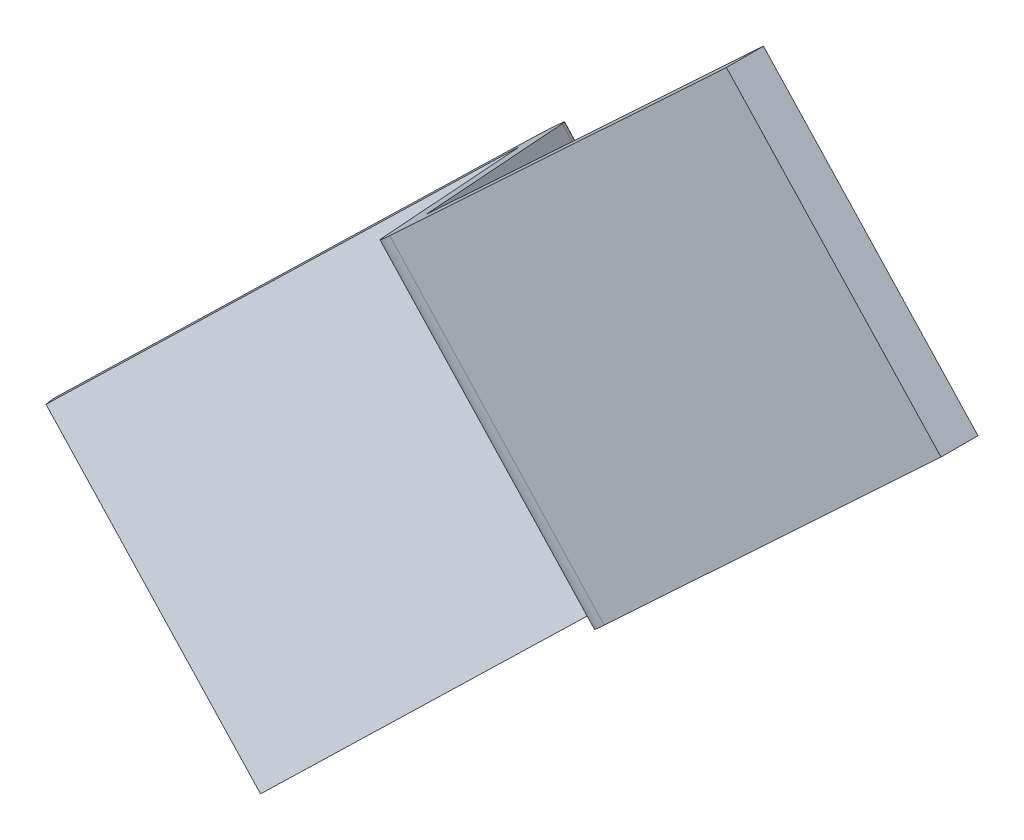
ISO-10303-21;
HEADER;
FILE_DESCRIPTION(('STEP AP214'),'2;1');
FILE_NAME('part.step','',(''),(''),'','','');
FILE_SCHEMA(('AUTOMOTIVE_DESIGN { 1 0 10303 214 1 1 1 1 }'));
ENDSEC;
DATA;
#1=APPLICATION_CONTEXT('core data for automotive mechanical design processes');
#2=APPLICATION_PROTOCOL_DEFINITION('international standard','automotive_design',2000,#1);
#3=PRODUCT_CONTEXT('',#1,'mechanical');
#4=PRODUCT('Part','Part','',(#3));
#5=PRODUCT_RELATED_PRODUCT_CATEGORY('part','',(#4));
#6=PRODUCT_DEFINITION_FORMATION('','',#4);
#7=PRODUCT_DEFINITION_CONTEXT('part definition',#1,'design');
#8=PRODUCT_DEFINITION('design','',#6,#7);
#9=PRODUCT_DEFINITION_SHAPE('','',#8);
#10=(LENGTH_UNIT() NAMED_UNIT(*) SI_UNIT(.MILLI.,.METRE.));
#11=(NAMED_UNIT(*) PLANE_ANGLE_UNIT() SI_UNIT($,.RADIAN.));
#12=(NAMED_UNIT(*) SI_UNIT($,.STERADIAN.) SOLID_ANGLE_UNIT());
#13=UNCERTAINTY_MEASURE_WITH_UNIT(LENGTH_MEASURE(1.E-05),#10,'distance_accuracy_value','');
#14=(GEOMETRIC_REPRESENTATION_CONTEXT(3) GLOBAL_UNCERTAINTY_ASSIGNED_CONTEXT((#13)) GLOBAL_UNIT_ASSIGNED_CONTEXT((#10,
#11,#12)) REPRESENTATION_CONTEXT('',''));
#15=CARTESIAN_POINT('',(0.,0.,0.));
#16=DIRECTION('',(0.,0.,1.));
#17=DIRECTION('',(1.,0.,0.));
#18=AXIS2_PLACEMENT_3D('',#15,#16,#17);
#19=CARTESIAN_POINT('',(22.9122875965679,20.3534318370849,-7.62204851457724));
#20=DIRECTION('',(0.517187243764899,0.482200533893165,0.707106781186557));
#21=DIRECTION('',(0.807143437979565,0.,-0.59035537646957));
#22=AXIS2_PLACEMENT_3D('',#19,#20,#21);
#23=PLANE('',#22);
#24=DIRECTION('',(0.517187243764915,0.482200533893179,-0.707106781186536));
#25=VECTOR('',#24,1.);
#26=CARTESIAN_POINT('',(21.5375233187465,19.0716676854461,-5.74244851457725));
#27=LINE('',#26,#25);
#28=CARTESIAN_POINT('',(21.5375233187465,19.0716676854461,-5.74244851457725));
#29=VERTEX_POINT('',#28);
#30=CARTESIAN_POINT('',(22.8969066656849,20.3390913962233,-7.60101945661142));
#31=VERTEX_POINT('',#30);
#32=EDGE_CURVE('E86',#29,#31,#27,.T.);
#33=ORIENTED_EDGE('',*,*,#32,.F.);
#34=DIRECTION('',(0.681934534815275,-0.731413214418686,0.));
#35=VECTOR('',#34,1.);
#36=CARTESIAN_POINT('',(21.5375233187465,19.0716676854461,-5.74244851457725));
#37=LINE('',#36,#35);
#38=CARTESIAN_POINT('',(23.0098199794127,17.4925465555161,-5.74244851457724));
#39=VERTEX_POINT('',#38);
#40=EDGE_CURVE('E181',#29,#39,#37,.T.);
#41=ORIENTED_EDGE('',*,*,#40,.T.);
#42=DIRECTION('',(-0.517187243764908,-0.482200533893174,0.707106781186544));
#43=VECTOR('',#42,1.);
#44=CARTESIAN_POINT('',(24.3692033263511,18.7599702662934,-7.60101945661137));
#45=LINE('',#44,#43);
#46=CARTESIAN_POINT('',(24.369203326351,18.7599702662933,-7.60101945661137));
#47=VERTEX_POINT('',#46);
#48=EDGE_CURVE('E187',#47,#39,#45,.T.);
#49=ORIENTED_EDGE('',*,*,#48,.F.);
#50=DIRECTION('',(0.681934534815202,-0.731413214418754,0.));
#51=VECTOR('',#50,1.);
#52=CARTESIAN_POINT('',(22.8969066656849,20.3390913962234,-7.60101945661147));
#53=LINE('',#52,#51);
#54=EDGE_CURVE('E244',#47,#31,#53,.F.);
#55=ORIENTED_EDGE('',*,*,#54,.T.);
#56=EDGE_LOOP('',(#33,#41,#49,#55));
#57=FACE_BOUND('',#56,.T.);
#58=ADVANCED_FACE('F17',(#57),#23,.T.);
#59=CARTESIAN_POINT('',(21.4061577588302,18.9491887498372,-5.92205363699863));
#60=DIRECTION('',(0.51718724376491,0.482200533893174,-0.707106781186543));
#61=DIRECTION('',(-0.807143437979553,0.,-0.590355376469586));
#62=AXIS2_PLACEMENT_3D('',#59,#60,#61);
#63=PLANE('',#62);
#64=ORIENTED_EDGE('',*,*,#40,.F.);
#65=DIRECTION('',(0.517187243764958,0.482200533893111,0.707106781186551));
#66=VECTOR('',#65,1.);
#67=CARTESIAN_POINT('',(21.4061577588302,18.9491887498372,-5.92205363699863));
#68=LINE('',#67,#66);
#69=CARTESIAN_POINT('',(21.4061577588302,18.9491887498372,-5.92205363699864));
#70=VERTEX_POINT('',#69);
#71=EDGE_CURVE('E183',#70,#29,#68,.T.);
#72=ORIENTED_EDGE('',*,*,#71,.F.);
#73=DIRECTION('',(0.681934534815275,-0.731413214418686,0.));
#74=VECTOR('',#73,1.);
#75=CARTESIAN_POINT('',(21.4061577588302,18.9491887498372,-5.92205363699864));
#76=LINE('',#75,#74);
#77=CARTESIAN_POINT('',(22.8784544194964,17.3700676199072,-5.92205363699865));
#78=VERTEX_POINT('',#77);
#79=EDGE_CURVE('E234',#70,#78,#76,.T.);
#80=ORIENTED_EDGE('',*,*,#79,.T.);
#81=DIRECTION('',(-0.517187243764894,-0.482200533893157,-0.707106781186566));
#82=VECTOR('',#81,1.);
#83=CARTESIAN_POINT('',(23.0098199794127,17.4925465555161,-5.74244851457724));
#84=LINE('',#83,#82);
#85=EDGE_CURVE('E185',#39,#78,#84,.T.);
#86=ORIENTED_EDGE('',*,*,#85,.F.);
#87=EDGE_LOOP('',(#64,#72,#80,#86));
#88=FACE_BOUND('',#87,.T.);
#89=ADVANCED_FACE('F173',(#88),#63,.F.);
#90=CARTESIAN_POINT('',(22.9100432216765,20.3513392897842,-7.58305894436923));
#91=DIRECTION('',(0.681934534815202,-0.731413214418754,0.));
#92=DIRECTION('',(0.731413214418754,0.681934534815202,0.));
#93=AXIS2_PLACEMENT_3D('',#90,#91,#92);
#94=CYLINDRICAL_SURFACE('',#93,0.0254000000000002);
#95=DIRECTION('',(0.681934534815273,-0.731413214418687,0.));
#96=VECTOR('',#95,1.);
#97=CARTESIAN_POINT('',(22.9250730549741,20.3653523841282,-7.59798868977747));
#98=LINE('',#97,#96);
#99=CARTESIAN_POINT('',(22.925073054974,20.3653523841282,-7.59798868977746));
#100=VERTEX_POINT('',#99);
#101=CARTESIAN_POINT('',(24.3973697156402,18.7862312541982,-7.59798868977746));
#102=VERTEX_POINT('',#101);
#103=EDGE_CURVE('E226',#100,#102,#98,.T.);
#104=ORIENTED_EDGE('',*,*,#103,.F.);
#105=CARTESIAN_POINT('',(22.9100432216765,20.3513392897842,-7.58305894436923));
#106=DIRECTION('',(0.681934534815202,-0.731413214418754,0.));
#107=DIRECTION('',(0.731413214418754,0.681934534815202,0.));
#108=AXIS2_PLACEMENT_3D('',#105,#106,#107);
#109=CIRCLE('',#108,0.0254000000000002);
#110=EDGE_CURVE('E20',#31,#100,#109,.T.);
#111=ORIENTED_EDGE('',*,*,#110,.F.);
#112=ORIENTED_EDGE('',*,*,#54,.F.);
#113=CARTESIAN_POINT('',(24.3823398823425,18.7722181598541,-7.58305894436923));
#114=DIRECTION('',(0.681934534815202,-0.731413214418754,0.));
#115=DIRECTION('',(0.731413214418754,0.681934534815202,0.));
#116=AXIS2_PLACEMENT_3D('',#113,#114,#115);
#117=CIRCLE('',#116,0.0254000000000002);
#118=EDGE_CURVE('E225',#102,#47,#117,.F.);
#119=ORIENTED_EDGE('',*,*,#118,.F.);
#120=EDGE_LOOP('',(#104,#111,#112,#119));
#121=FACE_BOUND('',#120,.T.);
#122=ADVANCED_FACE('F170',(#121),#94,.F.);
#123=CARTESIAN_POINT('',(22.7809220366516,20.230952901476,-7.80165363699862));
#124=DIRECTION('',(0.517187243764899,0.482200533893165,0.707106781186557));
#125=DIRECTION('',(0.807143437979565,0.,-0.59035537646957));
#126=AXIS2_PLACEMENT_3D('',#123,#124,#125);
#127=PLANE('',#126);
#128=ORIENTED_EDGE('',*,*,#79,.F.);
#129=DIRECTION('',(-0.517187243764916,-0.482200533893175,0.707106781186538));
#130=VECTOR('',#129,1.);
#131=CARTESIAN_POINT('',(22.7655411057686,20.2166124606144,-7.78062457903277));
#132=LINE('',#131,#130);
#133=CARTESIAN_POINT('',(22.7655411057686,20.2166124606145,-7.78062457903277));
#134=VERTEX_POINT('',#133);
#135=EDGE_CURVE('E191',#134,#70,#132,.T.);
#136=ORIENTED_EDGE('',*,*,#135,.F.);
#137=DIRECTION('',(0.681934534815266,-0.731413214418694,0.));
#138=VECTOR('',#137,1.);
#139=CARTESIAN_POINT('',(22.7655411057686,20.2166124606145,-7.78062457903278));
#140=LINE('',#139,#138);
#141=CARTESIAN_POINT('',(24.2378377664348,18.6374913306845,-7.78062457903276));
#142=VERTEX_POINT('',#141);
#143=EDGE_CURVE('E222',#142,#134,#140,.F.);
#144=ORIENTED_EDGE('',*,*,#143,.F.);
#145=DIRECTION('',(0.517187243764915,0.482200533893175,-0.707106781186538));
#146=VECTOR('',#145,1.);
#147=CARTESIAN_POINT('',(22.8784544194964,17.3700676199072,-5.92205363699865));
#148=LINE('',#147,#146);
#149=EDGE_CURVE('E231',#78,#142,#148,.T.);
#150=ORIENTED_EDGE('',*,*,#149,.F.);
#151=EDGE_LOOP('',(#128,#136,#144,#150));
#152=FACE_BOUND('',#151,.T.);
#153=ADVANCED_FACE('F166',(#152),#127,.F.);
#154=CARTESIAN_POINT('',(24.0460886230661,21.4105334321013,-5.48844851457723));
#155=DIRECTION('',(-0.591725720375126,-0.551696627716727,0.587785252292476));
#156=DIRECTION('',(0.704740571445321,0.,0.709465099183126));
#157=AXIS2_PLACEMENT_3D('',#154,#155,#156);
#158=PLANE('',#157);
#159=DIRECTION('',(0.429913900767142,0.400831062593347,0.809016994374944));
#160=VECTOR('',#159,1.);
#161=CARTESIAN_POINT('',(22.925073054974,20.3653523841282,-7.59798868977746));
#162=LINE('',#161,#160);
#163=CARTESIAN_POINT('',(23.9848854737211,21.3534705566228,-5.6036213150867));
#164=VERTEX_POINT('',#163);
#165=EDGE_CURVE('E224',#100,#164,#162,.T.);
#166=ORIENTED_EDGE('',*,*,#165,.F.);
#167=ORIENTED_EDGE('',*,*,#103,.T.);
#168=DIRECTION('',(-0.429913900767142,-0.400831062593347,-0.809016994374944));
#169=VECTOR('',#168,1.);
#170=CARTESIAN_POINT('',(25.4571821343874,19.7743494266928,-5.60362131508671));
#171=LINE('',#170,#169);
#172=CARTESIAN_POINT('',(25.4571821343873,19.7743494266928,-5.60362131508671));
#173=VERTEX_POINT('',#172);
#174=EDGE_CURVE('E219',#173,#102,#171,.T.);
#175=ORIENTED_EDGE('',*,*,#174,.F.);
#176=DIRECTION('',(0.681934534815266,-0.731413214418694,0.));
#177=VECTOR('',#176,1.);
#178=CARTESIAN_POINT('',(23.9848854737211,21.3534705566227,-5.6036213150867));
#179=LINE('',#178,#177);
#180=EDGE_CURVE('E216',#164,#173,#179,.T.);
#181=ORIENTED_EDGE('',*,*,#180,.F.);
#182=EDGE_LOOP('',(#166,#167,#175,#181));
#183=FACE_BOUND('',#182,.T.);
#184=ADVANCED_FACE('F162',(#183),#158,.T.);
#185=CARTESIAN_POINT('',(22.9100432216765,20.3513392897842,-7.58305894436923));
#186=DIRECTION('',(0.681934534815266,-0.731413214418694,0.));
#187=DIRECTION('',(0.731413214418694,0.681934534815266,0.));
#188=AXIS2_PLACEMENT_3D('',#185,#186,#187);
#189=CYLINDRICAL_SURFACE('',#188,0.279400000000002);
#190=CARTESIAN_POINT('',(22.9100432216765,20.3513392897842,-7.58305894436923));
#191=DIRECTION('',(0.681934534815266,-0.731413214418694,0.));
#192=DIRECTION('',(0.731413214418694,0.681934534815266,0.));
#193=AXIS2_PLACEMENT_3D('',#190,#191,#192);
#194=CIRCLE('',#193,0.279400000000002);
#195=CARTESIAN_POINT('',(23.0753713879493,20.5054833275683,-7.74728614385977));
#196=VERTEX_POINT('',#195);
#197=EDGE_CURVE('E220',#134,#196,#194,.T.);
#198=ORIENTED_EDGE('',*,*,#197,.T.);
#199=DIRECTION('',(0.681934534815274,-0.731413214418687,0.));
#200=VECTOR('',#199,1.);
#201=CARTESIAN_POINT('',(23.0753713879493,20.5054833275683,-7.74728614385977));
#202=LINE('',#201,#200);
#203=CARTESIAN_POINT('',(24.5476680486155,18.9263621976383,-7.74728614385975));
#204=VERTEX_POINT('',#203);
#205=EDGE_CURVE('E255',#196,#204,#202,.T.);
#206=ORIENTED_EDGE('',*,*,#205,.T.);
#207=CARTESIAN_POINT('',(24.3823398823427,18.7722181598542,-7.58305894436923));
#208=DIRECTION('',(0.681934534815266,-0.731413214418694,0.));
#209=DIRECTION('',(0.731413214418694,0.681934534815266,0.));
#210=AXIS2_PLACEMENT_3D('',#207,#208,#209);
#211=CIRCLE('',#210,0.279400000000002);
#212=EDGE_CURVE('E223',#204,#142,#211,.F.);
#213=ORIENTED_EDGE('',*,*,#212,.T.);
#214=ORIENTED_EDGE('',*,*,#143,.T.);
#215=EDGE_LOOP('',(#198,#206,#213,#214));
#216=FACE_BOUND('',#215,.T.);
#217=ADVANCED_FACE('F158',(#216),#189,.T.);
#218=CARTESIAN_POINT('',(24.150213639994,21.5076145944068,-5.76784851457723));
#219=DIRECTION('',(0.681934534815266,-0.731413214418694,0.));
#220=DIRECTION('',(0.731413214418694,0.681934534815266,0.));
#221=AXIS2_PLACEMENT_3D('',#218,#219,#220);
#222=CYLINDRICAL_SURFACE('',#221,0.279400000000002);
#223=CARTESIAN_POINT('',(24.150213639994,21.5076145944068,-5.76784851457723));
#224=DIRECTION('',(0.681934534815266,-0.731413214418694,0.));
#225=DIRECTION('',(0.731413214418694,0.681934534815266,0.));
#226=AXIS2_PLACEMENT_3D('',#223,#224,#225);
#227=CIRCLE('',#226,0.279400000000002);
#228=CARTESIAN_POINT('',(24.150213639994,21.5076145944068,-5.48844851457722));
#229=VERTEX_POINT('',#228);
#230=EDGE_CURVE('E213',#164,#229,#227,.F.);
#231=ORIENTED_EDGE('',*,*,#230,.F.);
#232=ORIENTED_EDGE('',*,*,#180,.T.);
#233=CARTESIAN_POINT('',(25.6225103006601,19.9284934644768,-5.76784851457723));
#234=DIRECTION('',(0.681934534815266,-0.731413214418694,0.));
#235=DIRECTION('',(0.731413214418694,0.681934534815266,0.));
#236=AXIS2_PLACEMENT_3D('',#233,#234,#235);
#237=CIRCLE('',#236,0.279400000000002);
#238=CARTESIAN_POINT('',(25.6225103006601,19.9284934644769,-5.48844851457722));
#239=VERTEX_POINT('',#238);
#240=EDGE_CURVE('E217',#173,#239,#237,.F.);
#241=ORIENTED_EDGE('',*,*,#240,.T.);
#242=DIRECTION('',(0.68193453481529,-0.731413214418672,0.));
#243=VECTOR('',#242,1.);
#244=CARTESIAN_POINT('',(24.150213639994,21.5076145944068,-5.48844851457723));
#245=LINE('',#244,#243);
#246=EDGE_CURVE('E275',#229,#239,#245,.T.);
#247=ORIENTED_EDGE('',*,*,#246,.F.);
#248=EDGE_LOOP('',(#231,#232,#241,#247));
#249=FACE_BOUND('',#248,.T.);
#250=ADVANCED_FACE('F154',(#249),#222,.T.);
#251=CARTESIAN_POINT('',(24.1963869560413,21.5506643755414,-5.63774596865952));
#252=DIRECTION('',(-0.591725720375126,-0.551696627716727,0.587785252292476));
#253=DIRECTION('',(0.704740571445321,0.,0.709465099183126));
#254=AXIS2_PLACEMENT_3D('',#251,#252,#253);
#255=PLANE('',#254);
#256=ORIENTED_EDGE('',*,*,#205,.F.);
#257=DIRECTION('',(-0.429913900767137,-0.400831062593349,-0.809016994374946));
#258=VECTOR('',#257,1.);
#259=CARTESIAN_POINT('',(24.1351838066964,21.4936015000628,-5.75291876916902));
#260=LINE('',#259,#258);
#261=CARTESIAN_POINT('',(24.1351838066964,21.4936015000628,-5.75291876916901));
#262=VERTEX_POINT('',#261);
#263=EDGE_CURVE('E215',#262,#196,#260,.T.);
#264=ORIENTED_EDGE('',*,*,#263,.F.);
#265=DIRECTION('',(0.681934534815202,-0.731413214418754,0.));
#266=VECTOR('',#265,1.);
#267=CARTESIAN_POINT('',(24.1351838066964,21.4936015000628,-5.752918769169));
#268=LINE('',#267,#266);
#269=CARTESIAN_POINT('',(25.6074804673625,19.9144803701328,-5.75291876916901));
#270=VERTEX_POINT('',#269);
#271=EDGE_CURVE('E208',#262,#270,#268,.T.);
#272=ORIENTED_EDGE('',*,*,#271,.T.);
#273=DIRECTION('',(0.429913900767137,0.400831062593349,0.809016994374946));
#274=VECTOR('',#273,1.);
#275=CARTESIAN_POINT('',(24.5476680486155,18.9263621976383,-7.74728614385976));
#276=LINE('',#275,#274);
#277=EDGE_CURVE('E258',#204,#270,#276,.T.);
#278=ORIENTED_EDGE('',*,*,#277,.F.);
#279=EDGE_LOOP('',(#256,#264,#272,#278));
#280=FACE_BOUND('',#279,.T.);
#281=ADVANCED_FACE('F150',(#280),#255,.F.);
#282=CARTESIAN_POINT('',(24.0460886230661,21.4105334321013,-5.48844851457723));
#283=DIRECTION('',(0.,0.,1.));
#284=DIRECTION('',(1.,0.,0.));
#285=AXIS2_PLACEMENT_3D('',#282,#283,#284);
#286=PLANE('',#285);
#287=DIRECTION('',(0.73141321441869,0.68193453481527,0.));
#288=VECTOR('',#287,1.);
#289=CARTESIAN_POINT('',(22.9100432216765,20.3513392897842,-5.48844851457722));
#290=LINE('',#289,#288);
#291=CARTESIAN_POINT('',(26.4612150570766,23.6622812660614,-5.48844851457721));
#292=VERTEX_POINT('',#291);
#293=EDGE_CURVE('E212',#292,#229,#290,.F.);
#294=ORIENTED_EDGE('',*,*,#293,.T.);
#295=ORIENTED_EDGE('',*,*,#246,.T.);
#296=DIRECTION('',(0.73141321441869,0.68193453481527,0.));
#297=VECTOR('',#296,1.);
#298=CARTESIAN_POINT('',(25.6074804673626,19.9144803701328,-5.48844851457721));
#299=LINE('',#298,#297);
#300=CARTESIAN_POINT('',(27.9335117177428,22.0831601361314,-5.48844851457721));
#301=VERTEX_POINT('',#300);
#302=EDGE_CURVE('E127',#301,#239,#299,.F.);
#303=ORIENTED_EDGE('',*,*,#302,.F.);
#304=DIRECTION('',(0.68193453481527,-0.73141321441869,0.));
#305=VECTOR('',#304,1.);
#306=CARTESIAN_POINT('',(26.4612150570766,23.6622812660614,-5.48844851457721));
#307=LINE('',#306,#305);
#308=EDGE_CURVE('E124',#301,#292,#307,.F.);
#309=ORIENTED_EDGE('',*,*,#308,.T.);
#310=EDGE_LOOP('',(#294,#295,#303,#309));
#311=FACE_BOUND('',#310,.T.);
#312=ADVANCED_FACE('F147',(#311),#286,.T.);
#313=CARTESIAN_POINT('',(26.4612150570766,23.6622812660614,-5.48844851457722));
#314=DIRECTION('',(-0.73141321441869,-0.68193453481527,0.));
#315=DIRECTION('',(0.68193453481527,-0.73141321441869,0.));
#316=AXIS2_PLACEMENT_3D('',#313,#314,#315);
#317=PLANE('',#316);
#318=DIRECTION('',(-0.681934534815256,0.731413214418704,0.));
#319=VECTOR('',#318,1.);
#320=CARTESIAN_POINT('',(27.9335117177428,22.0831601361314,-5.74244851457722));
#321=LINE('',#320,#319);
#322=CARTESIAN_POINT('',(27.9335117177428,22.0831601361314,-5.74244851457722));
#323=VERTEX_POINT('',#322);
#324=CARTESIAN_POINT('',(26.4612150570766,23.6622812660614,-5.74244851457722));
#325=VERTEX_POINT('',#324);
#326=EDGE_CURVE('E111',#323,#325,#321,.T.);
#327=ORIENTED_EDGE('',*,*,#326,.T.);
#328=DIRECTION('',(0.,0.,1.));
#329=VECTOR('',#328,1.);
#330=CARTESIAN_POINT('',(26.4612150570766,23.6622812660614,-7.58305894436923));
#331=LINE('',#330,#329);
#332=EDGE_CURVE('E263',#325,#292,#331,.T.);
#333=ORIENTED_EDGE('',*,*,#332,.T.);
#334=ORIENTED_EDGE('',*,*,#308,.F.);
#335=DIRECTION('',(0.,0.,1.));
#336=VECTOR('',#335,1.);
#337=CARTESIAN_POINT('',(27.9335117177428,22.0831601361314,-5.752918769169));
#338=LINE('',#337,#336);
#339=EDGE_CURVE('E120',#323,#301,#338,.T.);
#340=ORIENTED_EDGE('',*,*,#339,.F.);
#341=EDGE_LOOP('',(#327,#333,#334,#340));
#342=FACE_BOUND('',#341,.T.);
#343=ADVANCED_FACE('F123',(#342),#317,.F.);
#344=CARTESIAN_POINT('',(22.9100432216765,20.3513392897842,-7.58305894436923));
#345=DIRECTION('',(0.68193453481527,-0.73141321441869,0.));
#346=DIRECTION('',(0.73141321441869,0.68193453481527,0.));
#347=AXIS2_PLACEMENT_3D('',#344,#345,#346);
#348=PLANE('',#347);
#349=DIRECTION('',(-0.731413214418694,-0.681934534815266,0.));
#350=VECTOR('',#349,1.);
#351=CARTESIAN_POINT('',(26.4612150570766,23.6622812660614,-5.74244851457722));
#352=LINE('',#351,#350);
#353=CARTESIAN_POINT('',(24.150213639994,21.5076145944068,-5.74244851457723));
#354=VERTEX_POINT('',#353);
#355=EDGE_CURVE('E117',#325,#354,#352,.T.);
#356=ORIENTED_EDGE('',*,*,#355,.T.);
#357=CARTESIAN_POINT('',(24.1502136399939,21.5076145944068,-5.76784851457723));
#358=DIRECTION('',(0.681934534815202,-0.731413214418754,0.));
#359=DIRECTION('',(0.731413214418754,0.681934534815202,0.));
#360=AXIS2_PLACEMENT_3D('',#357,#358,#359);
#361=CIRCLE('',#360,0.0254000000000002);
#362=EDGE_CURVE('E209',#354,#262,#361,.T.);
#363=ORIENTED_EDGE('',*,*,#362,.T.);
#364=ORIENTED_EDGE('',*,*,#263,.T.);
#365=ORIENTED_EDGE('',*,*,#197,.F.);
#366=ORIENTED_EDGE('',*,*,#135,.T.);
#367=ORIENTED_EDGE('',*,*,#71,.T.);
#368=ORIENTED_EDGE('',*,*,#32,.T.);
#369=ORIENTED_EDGE('',*,*,#110,.T.);
#370=ORIENTED_EDGE('',*,*,#165,.T.);
#371=ORIENTED_EDGE('',*,*,#230,.T.);
#372=ORIENTED_EDGE('',*,*,#293,.F.);
#373=ORIENTED_EDGE('',*,*,#332,.F.);
#374=EDGE_LOOP('',(#356,#363,#364,#365,#366,#367,#368,#369,#370,#371,#372,#373));
#375=FACE_BOUND('',#374,.T.);
#376=ADVANCED_FACE('F139',(#375),#348,.F.);
#377=CARTESIAN_POINT('',(24.150213639994,21.5076145944068,-5.76784851457723));
#378=DIRECTION('',(0.681934534815202,-0.731413214418754,0.));
#379=DIRECTION('',(0.731413214418754,0.681934534815202,0.));
#380=AXIS2_PLACEMENT_3D('',#377,#378,#379);
#381=CYLINDRICAL_SURFACE('',#380,0.0254000000000002);
#382=ORIENTED_EDGE('',*,*,#271,.F.);
#383=ORIENTED_EDGE('',*,*,#362,.F.);
#384=DIRECTION('',(0.681934534815253,-0.731413214418706,0.));
#385=VECTOR('',#384,1.);
#386=CARTESIAN_POINT('',(24.150213639994,21.5076145944069,-5.74244851457723));
#387=LINE('',#386,#385);
#388=CARTESIAN_POINT('',(25.6225103006601,19.9284934644768,-5.74244851457723));
#389=VERTEX_POINT('',#388);
#390=EDGE_CURVE('E26',#354,#389,#387,.T.);
#391=ORIENTED_EDGE('',*,*,#390,.T.);
#392=CARTESIAN_POINT('',(25.62251030066,19.9284934644767,-5.76784851457723));
#393=DIRECTION('',(0.681934534815202,-0.731413214418754,0.));
#394=DIRECTION('',(0.731413214418754,0.681934534815202,0.));
#395=AXIS2_PLACEMENT_3D('',#392,#393,#394);
#396=CIRCLE('',#395,0.0254000000000002);
#397=EDGE_CURVE('E34',#270,#389,#396,.F.);
#398=ORIENTED_EDGE('',*,*,#397,.F.);
#399=EDGE_LOOP('',(#382,#383,#391,#398));
#400=FACE_BOUND('',#399,.T.);
#401=ADVANCED_FACE('F131',(#400),#381,.F.);
#402=CARTESIAN_POINT('',(25.6074804673626,19.9144803701328,-5.752918769169));
#403=DIRECTION('',(0.68193453481527,-0.73141321441869,0.));
#404=DIRECTION('',(0.73141321441869,0.68193453481527,0.));
#405=AXIS2_PLACEMENT_3D('',#402,#403,#404);
#406=PLANE('',#405);
#407=DIRECTION('',(0.731413214418693,0.681934534815267,0.));
#408=VECTOR('',#407,1.);
#409=CARTESIAN_POINT('',(25.6225103006601,19.9284934644768,-5.74244851457723));
#410=LINE('',#409,#408);
#411=EDGE_CURVE('E11',#389,#323,#410,.T.);
#412=ORIENTED_EDGE('',*,*,#411,.T.);
#413=ORIENTED_EDGE('',*,*,#339,.T.);
#414=ORIENTED_EDGE('',*,*,#302,.T.);
#415=ORIENTED_EDGE('',*,*,#240,.F.);
#416=ORIENTED_EDGE('',*,*,#174,.T.);
#417=ORIENTED_EDGE('',*,*,#118,.T.);
#418=ORIENTED_EDGE('',*,*,#48,.T.);
#419=ORIENTED_EDGE('',*,*,#85,.T.);
#420=ORIENTED_EDGE('',*,*,#149,.T.);
#421=ORIENTED_EDGE('',*,*,#212,.F.);
#422=ORIENTED_EDGE('',*,*,#277,.T.);
#423=ORIENTED_EDGE('',*,*,#397,.T.);
#424=EDGE_LOOP('',(#412,#413,#414,#415,#416,#417,#418,#419,#420,#421,#422,#423));
#425=FACE_BOUND('',#424,.T.);
#426=ADVANCED_FACE('F129',(#425),#406,.T.);
#427=CARTESIAN_POINT('',(24.0460886230661,21.4105334321013,-5.74244851457723));
#428=DIRECTION('',(0.,0.,1.));
#429=DIRECTION('',(1.,0.,0.));
#430=AXIS2_PLACEMENT_3D('',#427,#428,#429);
#431=PLANE('',#430);
#432=ORIENTED_EDGE('',*,*,#390,.F.);
#433=ORIENTED_EDGE('',*,*,#355,.F.);
#434=ORIENTED_EDGE('',*,*,#326,.F.);
#435=ORIENTED_EDGE('',*,*,#411,.F.);
#436=EDGE_LOOP('',(#432,#433,#434,#435));
#437=FACE_BOUND('',#436,.T.);
#438=ADVANCED_FACE('F114',(#437),#431,.F.);
#439=CLOSED_SHELL('',(#58,#89,#122,#153,#184,#217,#250,#281,#312,#343,#376,#401,#426,#438));
#440=MANIFOLD_SOLID_BREP('B1',#439);
#441=ADVANCED_BREP_SHAPE_REPRESENTATION('',(#18,#440),#14);
#442=SHAPE_DEFINITION_REPRESENTATION(#9,#441);
ENDSEC;
END-ISO-10303-21;
